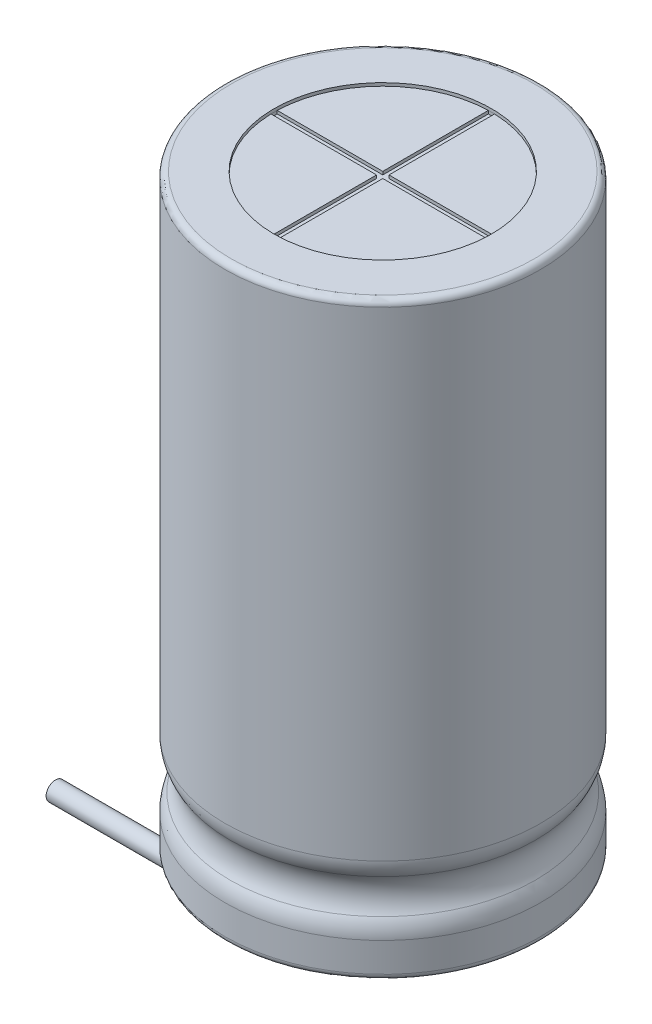
ISO-10303-21;
HEADER;
FILE_DESCRIPTION(('STEP AP214'),'2;1');
FILE_NAME('part.step','',(''),(''),'','','');
FILE_SCHEMA(('AUTOMOTIVE_DESIGN { 1 0 10303 214 1 1 1 1 }'));
ENDSEC;
DATA;
#1=APPLICATION_CONTEXT('core data for automotive mechanical design processes');
#2=APPLICATION_PROTOCOL_DEFINITION('international standard','automotive_design',2000,#1);
#3=PRODUCT_CONTEXT('',#1,'mechanical');
#4=PRODUCT('Part','Part','',(#3));
#5=PRODUCT_RELATED_PRODUCT_CATEGORY('part','',(#4));
#6=PRODUCT_DEFINITION_FORMATION('','',#4);
#7=PRODUCT_DEFINITION_CONTEXT('part definition',#1,'design');
#8=PRODUCT_DEFINITION('design','',#6,#7);
#9=PRODUCT_DEFINITION_SHAPE('','',#8);
#10=(LENGTH_UNIT() NAMED_UNIT(*) SI_UNIT(.MILLI.,.METRE.));
#11=(NAMED_UNIT(*) PLANE_ANGLE_UNIT() SI_UNIT($,.RADIAN.));
#12=(NAMED_UNIT(*) SI_UNIT($,.STERADIAN.) SOLID_ANGLE_UNIT());
#13=UNCERTAINTY_MEASURE_WITH_UNIT(LENGTH_MEASURE(1.E-05),#10,'distance_accuracy_value','');
#14=(GEOMETRIC_REPRESENTATION_CONTEXT(3) GLOBAL_UNCERTAINTY_ASSIGNED_CONTEXT((#13)) GLOBAL_UNIT_ASSIGNED_CONTEXT((#10,
#11,#12)) REPRESENTATION_CONTEXT('',''));
#15=CARTESIAN_POINT('',(0.,0.,0.));
#16=DIRECTION('',(0.,0.,1.));
#17=DIRECTION('',(1.,0.,0.));
#18=AXIS2_PLACEMENT_3D('',#15,#16,#17);
#19=CARTESIAN_POINT('',(0.,18.9,0.));
#20=DIRECTION('',(0.,1.,0.));
#21=DIRECTION('',(0.,0.,1.));
#22=AXIS2_PLACEMENT_3D('',#19,#20,#21);
#23=PLANE('',#22);
#24=DIRECTION('',(-1.,0.,0.));
#25=VECTOR('',#24,1.);
#26=CARTESIAN_POINT('',(0.,18.9,-0.1));
#27=LINE('',#26,#25);
#28=CARTESIAN_POINT('',(3.49857113690718,18.9,-0.100000000000012));
#29=VERTEX_POINT('',#28);
#30=CARTESIAN_POINT('',(0.1,18.9,-0.100000000000001));
#31=VERTEX_POINT('',#30);
#32=EDGE_CURVE('E267',#29,#31,#27,.T.);
#33=ORIENTED_EDGE('',*,*,#32,.F.);
#34=CARTESIAN_POINT('',(0.,18.9,0.));
#35=DIRECTION('',(0.,1.,0.));
#36=DIRECTION('',(0.,0.,1.));
#37=AXIS2_PLACEMENT_3D('',#34,#35,#36);
#38=CIRCLE('',#37,3.5);
#39=CARTESIAN_POINT('',(0.1,18.9,-3.49857113690718));
#40=VERTEX_POINT('',#39);
#41=EDGE_CURVE('E333',#29,#40,#38,.T.);
#42=ORIENTED_EDGE('',*,*,#41,.T.);
#43=DIRECTION('',(0.,0.,-1.));
#44=VECTOR('',#43,1.);
#45=CARTESIAN_POINT('',(0.1,18.9,0.));
#46=LINE('',#45,#44);
#47=EDGE_CURVE('E309',#31,#40,#46,.T.);
#48=ORIENTED_EDGE('',*,*,#47,.F.);
#49=EDGE_LOOP('',(#33,#42,#48));
#50=FACE_BOUND('',#49,.T.);
#51=ADVANCED_FACE('F41',(#50),#23,.T.);
#52=CARTESIAN_POINT('',(-0.1,18.9,-0.0999999999999998));
#53=VERTEX_POINT('',#52);
#54=CARTESIAN_POINT('',(-3.49857113690718,18.9,-0.099999999999988));
#55=VERTEX_POINT('',#54);
#56=EDGE_CURVE('E477',#53,#55,#27,.T.);
#57=ORIENTED_EDGE('',*,*,#56,.F.);
#58=DIRECTION('',(0.,0.,1.));
#59=VECTOR('',#58,1.);
#60=CARTESIAN_POINT('',(-0.1,18.9,0.));
#61=LINE('',#60,#59);
#62=CARTESIAN_POINT('',(-0.1,18.9,-3.49857113690718));
#63=VERTEX_POINT('',#62);
#64=EDGE_CURVE('E45',#63,#53,#61,.T.);
#65=ORIENTED_EDGE('',*,*,#64,.F.);
#66=EDGE_CURVE('E454',#63,#55,#38,.T.);
#67=ORIENTED_EDGE('',*,*,#66,.T.);
#68=EDGE_LOOP('',(#57,#65,#67));
#69=FACE_BOUND('',#68,.T.);
#70=ADVANCED_FACE('F411',(#69),#23,.T.);
#71=DIRECTION('',(1.,0.,0.));
#72=VECTOR('',#71,1.);
#73=CARTESIAN_POINT('',(0.,18.9,0.0999999999999998));
#74=LINE('',#73,#72);
#75=CARTESIAN_POINT('',(-3.49857113690718,18.9,0.100000000000012));
#76=VERTEX_POINT('',#75);
#77=CARTESIAN_POINT('',(-0.1,18.9,0.100000000000012));
#78=VERTEX_POINT('',#77);
#79=EDGE_CURVE('E272',#76,#78,#74,.T.);
#80=ORIENTED_EDGE('',*,*,#79,.F.);
#81=CARTESIAN_POINT('',(-0.1,18.9,3.49857113690718));
#82=VERTEX_POINT('',#81);
#83=EDGE_CURVE('E451',#76,#82,#38,.T.);
#84=ORIENTED_EDGE('',*,*,#83,.T.);
#85=DIRECTION('',(0.,0.,1.));
#86=VECTOR('',#85,1.);
#87=CARTESIAN_POINT('',(-0.1,18.9,0.));
#88=LINE('',#87,#86);
#89=EDGE_CURVE('E226',#78,#82,#88,.T.);
#90=ORIENTED_EDGE('',*,*,#89,.F.);
#91=EDGE_LOOP('',(#80,#84,#90));
#92=FACE_BOUND('',#91,.T.);
#93=ADVANCED_FACE('F404',(#92),#23,.T.);
#94=CARTESIAN_POINT('',(0.,0.,0.));
#95=DIRECTION('',(0.,1.,0.));
#96=DIRECTION('',(0.,0.,1.));
#97=AXIS2_PLACEMENT_3D('',#94,#95,#96);
#98=PLANE('',#97);
#99=CARTESIAN_POINT('',(0.,0.,0.));
#100=DIRECTION('',(0.,-1.,0.));
#101=DIRECTION('',(0.,0.,-1.));
#102=AXIS2_PLACEMENT_3D('',#99,#100,#101);
#103=CIRCLE('',#102,3.5);
#104=CARTESIAN_POINT('',(0.,0.,-3.5));
#105=VERTEX_POINT('',#104);
#106=EDGE_CURVE('E390',#105,#105,#103,.T.);
#107=ORIENTED_EDGE('',*,*,#106,.F.);
#108=EDGE_LOOP('',(#107));
#109=FACE_BOUND('',#108,.T.);
#110=CARTESIAN_POINT('',(0.,0.,0.));
#111=DIRECTION('',(0.,1.,0.));
#112=DIRECTION('',(0.,0.,1.));
#113=AXIS2_PLACEMENT_3D('',#110,#111,#112);
#114=CIRCLE('',#113,4.88);
#115=CARTESIAN_POINT('',(0.,0.,4.88));
#116=VERTEX_POINT('',#115);
#117=EDGE_CURVE('E362',#116,#116,#114,.T.);
#118=ORIENTED_EDGE('',*,*,#117,.F.);
#119=EDGE_LOOP('',(#118));
#120=FACE_BOUND('',#119,.T.);
#121=ADVANCED_FACE('F43',(#109,#120),#98,.F.);
#122=CARTESIAN_POINT('',(0.,0.2,0.));
#123=DIRECTION('',(0.,1.,0.));
#124=DIRECTION('',(0.,0.,1.));
#125=AXIS2_PLACEMENT_3D('',#122,#123,#124);
#126=TOROIDAL_SURFACE('',#125,4.88,0.2);
#127=CARTESIAN_POINT('',(0.,0.200000000000002,0.));
#128=DIRECTION('',(0.,1.,0.));
#129=DIRECTION('',(0.,0.,1.));
#130=AXIS2_PLACEMENT_3D('',#127,#128,#129);
#131=CIRCLE('',#130,5.08);
#132=CARTESIAN_POINT('',(0.,0.200000000000002,5.08));
#133=VERTEX_POINT('',#132);
#134=EDGE_CURVE('E359',#133,#133,#131,.T.);
#135=ORIENTED_EDGE('',*,*,#134,.F.);
#136=EDGE_LOOP('',(#135));
#137=FACE_BOUND('',#136,.T.);
#138=ORIENTED_EDGE('',*,*,#117,.T.);
#139=EDGE_LOOP('',(#138));
#140=FACE_BOUND('',#139,.T.);
#141=ADVANCED_FACE('F403',(#137,#140),#126,.T.);
#142=CARTESIAN_POINT('',(0.,19.,0.));
#143=DIRECTION('',(0.,1.,0.));
#144=DIRECTION('',(0.,0.,1.));
#145=AXIS2_PLACEMENT_3D('',#142,#143,#144);
#146=CYLINDRICAL_SURFACE('',#145,5.08);
#147=CARTESIAN_POINT('',(0.,1.14367937359519,0.));
#148=DIRECTION('',(0.,1.,0.));
#149=DIRECTION('',(0.,0.,1.));
#150=AXIS2_PLACEMENT_3D('',#147,#148,#149);
#151=CIRCLE('',#150,5.08);
#152=CARTESIAN_POINT('',(0.,1.14367937359519,5.08));
#153=VERTEX_POINT('',#152);
#154=EDGE_CURVE('E355',#153,#153,#151,.T.);
#155=ORIENTED_EDGE('',*,*,#154,.F.);
#156=EDGE_LOOP('',(#155));
#157=FACE_BOUND('',#156,.T.);
#158=ORIENTED_EDGE('',*,*,#134,.T.);
#159=EDGE_LOOP('',(#158));
#160=FACE_BOUND('',#159,.T.);
#161=ADVANCED_FACE('F409',(#157,#160),#146,.T.);
#162=CARTESIAN_POINT('',(0.,1.14367937359519,0.));
#163=DIRECTION('',(0.,1.,0.));
#164=DIRECTION('',(0.,0.,1.));
#165=AXIS2_PLACEMENT_3D('',#162,#163,#164);
#166=TOROIDAL_SURFACE('',#165,4.07781010847162,1.00218989152838);
#167=CARTESIAN_POINT('',(0.,1.69270827774518,0.));
#168=DIRECTION('',(0.,1.,0.));
#169=DIRECTION('',(0.,0.,1.));
#170=AXIS2_PLACEMENT_3D('',#167,#168,#169);
#171=CIRCLE('',#170,4.91623234165102);
#172=CARTESIAN_POINT('',(0.,1.69270827774518,4.91623234165102));
#173=VERTEX_POINT('',#172);
#174=EDGE_CURVE('E351',#173,#173,#171,.T.);
#175=ORIENTED_EDGE('',*,*,#174,.F.);
#176=EDGE_LOOP('',(#175));
#177=FACE_BOUND('',#176,.T.);
#178=ORIENTED_EDGE('',*,*,#154,.T.);
#179=EDGE_LOOP('',(#178));
#180=FACE_BOUND('',#179,.T.);
#181=ADVANCED_FACE('F908',(#177,#180),#166,.T.);
#182=CARTESIAN_POINT('',(0.,2.25,0.));
#183=DIRECTION('',(0.,1.,0.));
#184=DIRECTION('',(0.,0.,1.));
#185=AXIS2_PLACEMENT_3D('',#182,#183,#184);
#186=TOROIDAL_SURFACE('',#185,5.76727272727273,1.01727272727273);
#187=CARTESIAN_POINT('',(0.,2.80729172225482,0.));
#188=DIRECTION('',(0.,1.,0.));
#189=DIRECTION('',(0.,0.,1.));
#190=AXIS2_PLACEMENT_3D('',#187,#188,#189);
#191=CIRCLE('',#190,4.91623234165102);
#192=CARTESIAN_POINT('',(0.,2.80729172225482,4.91623234165102));
#193=VERTEX_POINT('',#192);
#194=EDGE_CURVE('E347',#193,#193,#191,.T.);
#195=ORIENTED_EDGE('',*,*,#194,.F.);
#196=EDGE_LOOP('',(#195));
#197=FACE_BOUND('',#196,.T.);
#198=ORIENTED_EDGE('',*,*,#174,.T.);
#199=EDGE_LOOP('',(#198));
#200=FACE_BOUND('',#199,.T.);
#201=ADVANCED_FACE('F898',(#197,#200),#186,.F.);
#202=CARTESIAN_POINT('',(0.,3.35632062640481,0.));
#203=DIRECTION('',(0.,1.,0.));
#204=DIRECTION('',(0.,0.,1.));
#205=AXIS2_PLACEMENT_3D('',#202,#203,#204);
#206=TOROIDAL_SURFACE('',#205,4.07781010847162,1.00218989152838);
#207=CARTESIAN_POINT('',(0.,3.35632062640481,0.));
#208=DIRECTION('',(0.,1.,0.));
#209=DIRECTION('',(0.,0.,1.));
#210=AXIS2_PLACEMENT_3D('',#207,#208,#209);
#211=CIRCLE('',#210,5.08);
#212=CARTESIAN_POINT('',(0.,3.35632062640481,5.08));
#213=VERTEX_POINT('',#212);
#214=EDGE_CURVE('E343',#213,#213,#211,.T.);
#215=ORIENTED_EDGE('',*,*,#214,.F.);
#216=EDGE_LOOP('',(#215));
#217=FACE_BOUND('',#216,.T.);
#218=ORIENTED_EDGE('',*,*,#194,.T.);
#219=EDGE_LOOP('',(#218));
#220=FACE_BOUND('',#219,.T.);
#221=ADVANCED_FACE('F888',(#217,#220),#206,.T.);
#222=CARTESIAN_POINT('',(0.,19.,0.));
#223=DIRECTION('',(0.,1.,0.));
#224=DIRECTION('',(0.,0.,1.));
#225=AXIS2_PLACEMENT_3D('',#222,#223,#224);
#226=CYLINDRICAL_SURFACE('',#225,5.08);
#227=CARTESIAN_POINT('',(0.,18.8,0.));
#228=DIRECTION('',(0.,1.,0.));
#229=DIRECTION('',(0.,0.,1.));
#230=AXIS2_PLACEMENT_3D('',#227,#228,#229);
#231=CIRCLE('',#230,5.08);
#232=CARTESIAN_POINT('',(0.,18.8,5.08));
#233=VERTEX_POINT('',#232);
#234=EDGE_CURVE('E340',#233,#233,#231,.T.);
#235=ORIENTED_EDGE('',*,*,#234,.F.);
#236=EDGE_LOOP('',(#235));
#237=FACE_BOUND('',#236,.T.);
#238=ORIENTED_EDGE('',*,*,#214,.T.);
#239=EDGE_LOOP('',(#238));
#240=FACE_BOUND('',#239,.T.);
#241=ADVANCED_FACE('F878',(#237,#240),#226,.T.);
#242=CARTESIAN_POINT('',(0.,18.8,0.));
#243=DIRECTION('',(0.,1.,0.));
#244=DIRECTION('',(0.,0.,1.));
#245=AXIS2_PLACEMENT_3D('',#242,#243,#244);
#246=TOROIDAL_SURFACE('',#245,4.88,0.199999999999999);
#247=CARTESIAN_POINT('',(0.,19.,0.));
#248=DIRECTION('',(0.,1.,0.));
#249=DIRECTION('',(0.,0.,1.));
#250=AXIS2_PLACEMENT_3D('',#247,#248,#249);
#251=CIRCLE('',#250,4.88);
#252=CARTESIAN_POINT('',(0.,19.,4.88));
#253=VERTEX_POINT('',#252);
#254=EDGE_CURVE('E332',#253,#253,#251,.T.);
#255=ORIENTED_EDGE('',*,*,#254,.F.);
#256=EDGE_LOOP('',(#255));
#257=FACE_BOUND('',#256,.T.);
#258=ORIENTED_EDGE('',*,*,#234,.T.);
#259=EDGE_LOOP('',(#258));
#260=FACE_BOUND('',#259,.T.);
#261=ADVANCED_FACE('F868',(#257,#260),#246,.T.);
#262=CARTESIAN_POINT('',(0.,19.,-4.88));
#263=DIRECTION('',(0.,-1.,0.));
#264=DIRECTION('',(0.,0.,-1.));
#265=AXIS2_PLACEMENT_3D('',#262,#263,#264);
#266=PLANE('',#265);
#267=CARTESIAN_POINT('',(0.,19.,0.));
#268=DIRECTION('',(0.,1.,0.));
#269=DIRECTION('',(0.,0.,1.));
#270=AXIS2_PLACEMENT_3D('',#267,#268,#269);
#271=CIRCLE('',#270,3.5);
#272=CARTESIAN_POINT('',(0.,19.,3.5));
#273=VERTEX_POINT('',#272);
#274=EDGE_CURVE('E325',#273,#273,#271,.T.);
#275=ORIENTED_EDGE('',*,*,#274,.F.);
#276=EDGE_LOOP('',(#275));
#277=FACE_BOUND('',#276,.T.);
#278=ORIENTED_EDGE('',*,*,#254,.T.);
#279=EDGE_LOOP('',(#278));
#280=FACE_BOUND('',#279,.T.);
#281=ADVANCED_FACE('F434',(#277,#280),#266,.F.);
#282=CARTESIAN_POINT('',(0.,18.9,0.));
#283=DIRECTION('',(0.,1.,0.));
#284=DIRECTION('',(0.,0.,1.));
#285=AXIS2_PLACEMENT_3D('',#282,#283,#284);
#286=CYLINDRICAL_SURFACE('',#285,3.5);
#287=CARTESIAN_POINT('',(0.,18.9,-3.5));
#288=VERTEX_POINT('',#287);
#289=EDGE_CURVE('E329',#40,#288,#38,.T.);
#290=ORIENTED_EDGE('',*,*,#289,.F.);
#291=ORIENTED_EDGE('',*,*,#41,.F.);
#292=CARTESIAN_POINT('',(0.,18.9,0.));
#293=DIRECTION('',(0.,-1.,0.));
#294=DIRECTION('',(0.,0.,-1.));
#295=AXIS2_PLACEMENT_3D('',#292,#293,#294);
#296=CIRCLE('',#295,3.5);
#297=CARTESIAN_POINT('',(3.5,18.9,0.));
#298=VERTEX_POINT('',#297);
#299=EDGE_CURVE('E292',#298,#29,#296,.F.);
#300=ORIENTED_EDGE('',*,*,#299,.F.);
#301=CARTESIAN_POINT('',(3.49857113690718,18.9,0.0999999999999632));
#302=VERTEX_POINT('',#301);
#303=EDGE_CURVE('E295',#302,#298,#296,.F.);
#304=ORIENTED_EDGE('',*,*,#303,.F.);
#305=CARTESIAN_POINT('',(0.1,18.9,3.49857113690718));
#306=VERTEX_POINT('',#305);
#307=EDGE_CURVE('E440',#306,#302,#38,.T.);
#308=ORIENTED_EDGE('',*,*,#307,.F.);
#309=CARTESIAN_POINT('',(0.,18.9,3.5));
#310=VERTEX_POINT('',#309);
#311=EDGE_CURVE('E448',#310,#306,#296,.F.);
#312=ORIENTED_EDGE('',*,*,#311,.F.);
#313=EDGE_CURVE('E500',#82,#310,#296,.F.);
#314=ORIENTED_EDGE('',*,*,#313,.F.);
#315=ORIENTED_EDGE('',*,*,#83,.F.);
#316=CARTESIAN_POINT('',(-3.5,18.9,0.));
#317=VERTEX_POINT('',#316);
#318=EDGE_CURVE('E493',#317,#76,#296,.F.);
#319=ORIENTED_EDGE('',*,*,#318,.F.);
#320=EDGE_CURVE('E296',#55,#317,#296,.F.);
#321=ORIENTED_EDGE('',*,*,#320,.F.);
#322=ORIENTED_EDGE('',*,*,#66,.F.);
#323=EDGE_CURVE('E67',#288,#63,#38,.T.);
#324=ORIENTED_EDGE('',*,*,#323,.F.);
#325=EDGE_LOOP('',(#290,#291,#300,#304,#308,#312,#314,#315,#319,#321,#322,#324));
#326=FACE_BOUND('',#325,.T.);
#327=ORIENTED_EDGE('',*,*,#274,.T.);
#328=EDGE_LOOP('',(#327));
#329=FACE_BOUND('',#328,.T.);
#330=ADVANCED_FACE('F426',(#326,#329),#286,.F.);
#331=DIRECTION('',(0.,0.,-1.));
#332=VECTOR('',#331,1.);
#333=CARTESIAN_POINT('',(0.1,18.9,0.));
#334=LINE('',#333,#332);
#335=CARTESIAN_POINT('',(0.1,18.9,0.0999999999999988));
#336=VERTEX_POINT('',#335);
#337=EDGE_CURVE('E235',#306,#336,#334,.T.);
#338=ORIENTED_EDGE('',*,*,#337,.F.);
#339=ORIENTED_EDGE('',*,*,#307,.T.);
#340=DIRECTION('',(1.,0.,0.));
#341=VECTOR('',#340,1.);
#342=CARTESIAN_POINT('',(0.,18.9,0.0999999999999998));
#343=LINE('',#342,#341);
#344=EDGE_CURVE('E204',#336,#302,#343,.T.);
#345=ORIENTED_EDGE('',*,*,#344,.F.);
#346=EDGE_LOOP('',(#338,#339,#345));
#347=FACE_BOUND('',#346,.T.);
#348=ADVANCED_FACE('F414',(#347),#23,.T.);
#349=CARTESIAN_POINT('',(0.,18.9,0.));
#350=DIRECTION('',(0.,-1.,0.));
#351=DIRECTION('',(0.,0.,-1.));
#352=AXIS2_PLACEMENT_3D('',#349,#350,#351);
#353=PLANE('',#352);
#354=ORIENTED_EDGE('',*,*,#323,.T.);
#355=DIRECTION('',(0.,0.,1.));
#356=VECTOR('',#355,1.);
#357=CARTESIAN_POINT('',(-0.1,18.9,0.));
#358=LINE('',#357,#356);
#359=CARTESIAN_POINT('',(-0.1,18.9,-3.5));
#360=VERTEX_POINT('',#359);
#361=EDGE_CURVE('E301',#360,#63,#358,.T.);
#362=ORIENTED_EDGE('',*,*,#361,.F.);
#363=DIRECTION('',(-1.,0.,0.));
#364=VECTOR('',#363,1.);
#365=CARTESIAN_POINT('',(0.1,18.9,-3.5));
#366=LINE('',#365,#364);
#367=EDGE_CURVE('E313',#288,#360,#366,.T.);
#368=ORIENTED_EDGE('',*,*,#367,.F.);
#369=EDGE_LOOP('',(#354,#362,#368));
#370=FACE_BOUND('',#369,.T.);
#371=ADVANCED_FACE('F425',(#370),#353,.T.);
#372=ORIENTED_EDGE('',*,*,#289,.T.);
#373=CARTESIAN_POINT('',(0.1,18.9,-3.5));
#374=VERTEX_POINT('',#373);
#375=EDGE_CURVE('E315',#374,#288,#366,.T.);
#376=ORIENTED_EDGE('',*,*,#375,.F.);
#377=EDGE_CURVE('E314',#40,#374,#46,.T.);
#378=ORIENTED_EDGE('',*,*,#377,.F.);
#379=EDGE_LOOP('',(#372,#376,#378));
#380=FACE_BOUND('',#379,.T.);
#381=ADVANCED_FACE('F432',(#380),#353,.T.);
#382=CARTESIAN_POINT('',(-0.1,18.8,0.));
#383=DIRECTION('',(-1.,0.,0.));
#384=DIRECTION('',(0.,0.,1.));
#385=AXIS2_PLACEMENT_3D('',#382,#383,#384);
#386=PLANE('',#385);
#387=ORIENTED_EDGE('',*,*,#64,.T.);
#388=DIRECTION('',(0.,-1.,0.));
#389=VECTOR('',#388,1.);
#390=CARTESIAN_POINT('',(-0.1,18.8,-0.0999999999999998));
#391=LINE('',#390,#389);
#392=CARTESIAN_POINT('',(-0.1,18.8,-0.0999999999999998));
#393=VERTEX_POINT('',#392);
#394=EDGE_CURVE('E288',#53,#393,#391,.T.);
#395=ORIENTED_EDGE('',*,*,#394,.T.);
#396=DIRECTION('',(0.,0.,1.));
#397=VECTOR('',#396,1.);
#398=CARTESIAN_POINT('',(-0.1,18.8,0.));
#399=LINE('',#398,#397);
#400=CARTESIAN_POINT('',(-0.1,18.8,-3.5));
#401=VERTEX_POINT('',#400);
#402=EDGE_CURVE('E305',#401,#393,#399,.T.);
#403=ORIENTED_EDGE('',*,*,#402,.F.);
#404=DIRECTION('',(0.,1.,0.));
#405=VECTOR('',#404,1.);
#406=CARTESIAN_POINT('',(-0.1,18.8,-3.5));
#407=LINE('',#406,#405);
#408=EDGE_CURVE('E321',#401,#360,#407,.T.);
#409=ORIENTED_EDGE('',*,*,#408,.T.);
#410=ORIENTED_EDGE('',*,*,#361,.T.);
#411=EDGE_LOOP('',(#387,#395,#403,#409,#410));
#412=FACE_BOUND('',#411,.T.);
#413=ADVANCED_FACE('F519',(#412),#386,.F.);
#414=CARTESIAN_POINT('',(0.1,18.8,-3.5));
#415=DIRECTION('',(0.,0.,-1.));
#416=DIRECTION('',(-1.,0.,0.));
#417=AXIS2_PLACEMENT_3D('',#414,#415,#416);
#418=PLANE('',#417);
#419=ORIENTED_EDGE('',*,*,#375,.T.);
#420=ORIENTED_EDGE('',*,*,#367,.T.);
#421=ORIENTED_EDGE('',*,*,#408,.F.);
#422=DIRECTION('',(-1.,0.,0.));
#423=VECTOR('',#422,1.);
#424=CARTESIAN_POINT('',(0.1,18.8,-3.5));
#425=LINE('',#424,#423);
#426=CARTESIAN_POINT('',(0.1,18.8,-3.5));
#427=VERTEX_POINT('',#426);
#428=EDGE_CURVE('E300',#427,#401,#425,.T.);
#429=ORIENTED_EDGE('',*,*,#428,.F.);
#430=DIRECTION('',(0.,1.,0.));
#431=VECTOR('',#430,1.);
#432=CARTESIAN_POINT('',(0.1,18.8,-3.5));
#433=LINE('',#432,#431);
#434=EDGE_CURVE('E308',#427,#374,#433,.T.);
#435=ORIENTED_EDGE('',*,*,#434,.T.);
#436=EDGE_LOOP('',(#419,#420,#421,#429,#435));
#437=FACE_BOUND('',#436,.T.);
#438=ADVANCED_FACE('F554',(#437),#418,.F.);
#439=CARTESIAN_POINT('',(0.1,18.8,0.));
#440=DIRECTION('',(1.,0.,0.));
#441=DIRECTION('',(0.,0.,-1.));
#442=AXIS2_PLACEMENT_3D('',#439,#440,#441);
#443=PLANE('',#442);
#444=DIRECTION('',(0.,0.,-1.));
#445=VECTOR('',#444,1.);
#446=CARTESIAN_POINT('',(0.1,18.8,0.));
#447=LINE('',#446,#445);
#448=CARTESIAN_POINT('',(0.1,18.8,-0.1));
#449=VERTEX_POINT('',#448);
#450=EDGE_CURVE('E297',#449,#427,#447,.T.);
#451=ORIENTED_EDGE('',*,*,#450,.F.);
#452=DIRECTION('',(0.,1.,0.));
#453=VECTOR('',#452,1.);
#454=CARTESIAN_POINT('',(0.1,18.8,-0.100000000000001));
#455=LINE('',#454,#453);
#456=EDGE_CURVE('E281',#449,#31,#455,.T.);
#457=ORIENTED_EDGE('',*,*,#456,.T.);
#458=ORIENTED_EDGE('',*,*,#47,.T.);
#459=ORIENTED_EDGE('',*,*,#377,.T.);
#460=ORIENTED_EDGE('',*,*,#434,.F.);
#461=EDGE_LOOP('',(#451,#457,#458,#459,#460));
#462=FACE_BOUND('',#461,.T.);
#463=ADVANCED_FACE('F462',(#462),#443,.F.);
#464=CARTESIAN_POINT('',(0.,18.8,0.));
#465=DIRECTION('',(0.,-1.,0.));
#466=DIRECTION('',(0.,0.,-1.));
#467=AXIS2_PLACEMENT_3D('',#464,#465,#466);
#468=PLANE('',#467);
#469=ORIENTED_EDGE('',*,*,#402,.T.);
#470=DIRECTION('',(-1.,0.,0.));
#471=VECTOR('',#470,1.);
#472=CARTESIAN_POINT('',(0.,18.8,-0.1));
#473=LINE('',#472,#471);
#474=CARTESIAN_POINT('',(-3.5,18.8,-0.0999999999999879));
#475=VERTEX_POINT('',#474);
#476=EDGE_CURVE('E253',#393,#475,#473,.T.);
#477=ORIENTED_EDGE('',*,*,#476,.T.);
#478=DIRECTION('',(0.,0.,1.));
#479=VECTOR('',#478,1.);
#480=CARTESIAN_POINT('',(-3.5,18.8,-0.0999999999999879));
#481=LINE('',#480,#479);
#482=CARTESIAN_POINT('',(-3.5,18.8,0.100000000000012));
#483=VERTEX_POINT('',#482);
#484=EDGE_CURVE('E252',#475,#483,#481,.T.);
#485=ORIENTED_EDGE('',*,*,#484,.T.);
#486=DIRECTION('',(1.,0.,0.));
#487=VECTOR('',#486,1.);
#488=CARTESIAN_POINT('',(0.,18.8,0.0999999999999998));
#489=LINE('',#488,#487);
#490=CARTESIAN_POINT('',(-0.1,18.8,0.100000000000012));
#491=VERTEX_POINT('',#490);
#492=EDGE_CURVE('E257',#483,#491,#489,.T.);
#493=ORIENTED_EDGE('',*,*,#492,.T.);
#494=DIRECTION('',(0.,0.,1.));
#495=VECTOR('',#494,1.);
#496=CARTESIAN_POINT('',(-0.1,18.8,0.));
#497=LINE('',#496,#495);
#498=CARTESIAN_POINT('',(-0.1,18.8,3.5));
#499=VERTEX_POINT('',#498);
#500=EDGE_CURVE('E216',#491,#499,#497,.T.);
#501=ORIENTED_EDGE('',*,*,#500,.T.);
#502=DIRECTION('',(1.,0.,0.));
#503=VECTOR('',#502,1.);
#504=CARTESIAN_POINT('',(-0.1,18.8,3.5));
#505=LINE('',#504,#503);
#506=CARTESIAN_POINT('',(0.1,18.8,3.5));
#507=VERTEX_POINT('',#506);
#508=EDGE_CURVE('E219',#499,#507,#505,.T.);
#509=ORIENTED_EDGE('',*,*,#508,.T.);
#510=DIRECTION('',(0.,0.,-1.));
#511=VECTOR('',#510,1.);
#512=CARTESIAN_POINT('',(0.1,18.8,0.));
#513=LINE('',#512,#511);
#514=CARTESIAN_POINT('',(0.1,18.8,0.0999999999999988));
#515=VERTEX_POINT('',#514);
#516=EDGE_CURVE('E178',#507,#515,#513,.T.);
#517=ORIENTED_EDGE('',*,*,#516,.T.);
#518=DIRECTION('',(1.,0.,0.));
#519=VECTOR('',#518,1.);
#520=CARTESIAN_POINT('',(0.,18.8,0.0999999999999998));
#521=LINE('',#520,#519);
#522=CARTESIAN_POINT('',(3.5,18.8,0.0999999999999632));
#523=VERTEX_POINT('',#522);
#524=EDGE_CURVE('E170',#515,#523,#521,.T.);
#525=ORIENTED_EDGE('',*,*,#524,.T.);
#526=DIRECTION('',(0.,0.,-1.));
#527=VECTOR('',#526,1.);
#528=CARTESIAN_POINT('',(3.5,18.8,0.0999999999999632));
#529=LINE('',#528,#527);
#530=CARTESIAN_POINT('',(3.5,18.8,-0.100000000000037));
#531=VERTEX_POINT('',#530);
#532=EDGE_CURVE('E175',#523,#531,#529,.T.);
#533=ORIENTED_EDGE('',*,*,#532,.T.);
#534=EDGE_CURVE('E59',#531,#449,#473,.T.);
#535=ORIENTED_EDGE('',*,*,#534,.T.);
#536=ORIENTED_EDGE('',*,*,#450,.T.);
#537=ORIENTED_EDGE('',*,*,#428,.T.);
#538=EDGE_LOOP('',(#469,#477,#485,#493,#501,#509,#517,#525,#533,#535,#536,#537));
#539=FACE_BOUND('',#538,.T.);
#540=ADVANCED_FACE('F173',(#539),#468,.F.);
#541=CARTESIAN_POINT('',(0.,18.9,0.));
#542=DIRECTION('',(0.,-1.,0.));
#543=DIRECTION('',(-1.,0.,0.));
#544=AXIS2_PLACEMENT_3D('',#541,#542,#543);
#545=PLANE('',#544);
#546=ORIENTED_EDGE('',*,*,#320,.T.);
#547=DIRECTION('',(0.,0.,1.));
#548=VECTOR('',#547,1.);
#549=CARTESIAN_POINT('',(-3.5,18.9,-0.0999999999999879));
#550=LINE('',#549,#548);
#551=CARTESIAN_POINT('',(-3.5,18.9,-0.0999999999999879));
#552=VERTEX_POINT('',#551);
#553=EDGE_CURVE('E268',#552,#317,#550,.T.);
#554=ORIENTED_EDGE('',*,*,#553,.F.);
#555=EDGE_CURVE('E249',#55,#552,#27,.T.);
#556=ORIENTED_EDGE('',*,*,#555,.F.);
#557=EDGE_LOOP('',(#546,#554,#556));
#558=FACE_BOUND('',#557,.T.);
#559=ADVANCED_FACE('F491',(#558),#545,.T.);
#560=ORIENTED_EDGE('',*,*,#318,.T.);
#561=CARTESIAN_POINT('',(-3.5,18.9,0.100000000000012));
#562=VERTEX_POINT('',#561);
#563=EDGE_CURVE('E273',#562,#76,#74,.T.);
#564=ORIENTED_EDGE('',*,*,#563,.F.);
#565=EDGE_CURVE('E266',#317,#562,#550,.T.);
#566=ORIENTED_EDGE('',*,*,#565,.F.);
#567=EDGE_LOOP('',(#560,#564,#566));
#568=FACE_BOUND('',#567,.T.);
#569=ADVANCED_FACE('F496',(#568),#545,.T.);
#570=ORIENTED_EDGE('',*,*,#313,.T.);
#571=DIRECTION('',(1.,0.,0.));
#572=VECTOR('',#571,1.);
#573=CARTESIAN_POINT('',(-0.1,18.9,3.5));
#574=LINE('',#573,#572);
#575=CARTESIAN_POINT('',(-0.1,18.9,3.5));
#576=VERTEX_POINT('',#575);
#577=EDGE_CURVE('E231',#576,#310,#574,.T.);
#578=ORIENTED_EDGE('',*,*,#577,.F.);
#579=EDGE_CURVE('E215',#82,#576,#88,.T.);
#580=ORIENTED_EDGE('',*,*,#579,.F.);
#581=EDGE_LOOP('',(#570,#578,#580));
#582=FACE_BOUND('',#581,.T.);
#583=ADVANCED_FACE('F529',(#582),#545,.T.);
#584=ORIENTED_EDGE('',*,*,#311,.T.);
#585=CARTESIAN_POINT('',(0.1,18.9,3.5));
#586=VERTEX_POINT('',#585);
#587=EDGE_CURVE('E220',#586,#306,#334,.T.);
#588=ORIENTED_EDGE('',*,*,#587,.F.);
#589=EDGE_CURVE('E230',#310,#586,#574,.T.);
#590=ORIENTED_EDGE('',*,*,#589,.F.);
#591=EDGE_LOOP('',(#584,#588,#590));
#592=FACE_BOUND('',#591,.T.);
#593=ADVANCED_FACE('F531',(#592),#545,.T.);
#594=ORIENTED_EDGE('',*,*,#303,.T.);
#595=DIRECTION('',(0.,0.,-1.));
#596=VECTOR('',#595,1.);
#597=CARTESIAN_POINT('',(3.5,18.9,0.0999999999999632));
#598=LINE('',#597,#596);
#599=CARTESIAN_POINT('',(3.5,18.9,0.0999999999999632));
#600=VERTEX_POINT('',#599);
#601=EDGE_CURVE('E182',#600,#298,#598,.T.);
#602=ORIENTED_EDGE('',*,*,#601,.F.);
#603=EDGE_CURVE('E188',#302,#600,#343,.T.);
#604=ORIENTED_EDGE('',*,*,#603,.F.);
#605=EDGE_LOOP('',(#594,#602,#604));
#606=FACE_BOUND('',#605,.T.);
#607=ADVANCED_FACE('F510',(#606),#545,.T.);
#608=ORIENTED_EDGE('',*,*,#299,.T.);
#609=CARTESIAN_POINT('',(3.5,18.9,-0.100000000000037));
#610=VERTEX_POINT('',#609);
#611=EDGE_CURVE('E262',#610,#29,#27,.T.);
#612=ORIENTED_EDGE('',*,*,#611,.F.);
#613=EDGE_CURVE('E207',#298,#610,#598,.T.);
#614=ORIENTED_EDGE('',*,*,#613,.F.);
#615=EDGE_LOOP('',(#608,#612,#614));
#616=FACE_BOUND('',#615,.T.);
#617=ADVANCED_FACE('F513',(#616),#545,.T.);
#618=CARTESIAN_POINT('',(0.,18.8,-0.1));
#619=DIRECTION('',(0.,0.,-1.));
#620=DIRECTION('',(-1.,0.,0.));
#621=AXIS2_PLACEMENT_3D('',#618,#619,#620);
#622=PLANE('',#621);
#623=ORIENTED_EDGE('',*,*,#56,.T.);
#624=ORIENTED_EDGE('',*,*,#555,.T.);
#625=DIRECTION('',(0.,1.,0.));
#626=VECTOR('',#625,1.);
#627=CARTESIAN_POINT('',(-3.5,18.8,-0.0999999999999879));
#628=LINE('',#627,#626);
#629=EDGE_CURVE('E261',#475,#552,#628,.T.);
#630=ORIENTED_EDGE('',*,*,#629,.F.);
#631=ORIENTED_EDGE('',*,*,#476,.F.);
#632=ORIENTED_EDGE('',*,*,#394,.F.);
#633=EDGE_LOOP('',(#623,#624,#630,#631,#632));
#634=FACE_BOUND('',#633,.T.);
#635=ADVANCED_FACE('F484',(#634),#622,.F.);
#636=ORIENTED_EDGE('',*,*,#534,.F.);
#637=DIRECTION('',(0.,1.,0.));
#638=VECTOR('',#637,1.);
#639=CARTESIAN_POINT('',(3.5,18.8,-0.100000000000037));
#640=LINE('',#639,#638);
#641=EDGE_CURVE('E193',#531,#610,#640,.T.);
#642=ORIENTED_EDGE('',*,*,#641,.T.);
#643=ORIENTED_EDGE('',*,*,#611,.T.);
#644=ORIENTED_EDGE('',*,*,#32,.T.);
#645=ORIENTED_EDGE('',*,*,#456,.F.);
#646=EDGE_LOOP('',(#636,#642,#643,#644,#645));
#647=FACE_BOUND('',#646,.T.);
#648=ADVANCED_FACE('F515',(#647),#622,.F.);
#649=CARTESIAN_POINT('',(0.,18.8,0.0999999999999998));
#650=DIRECTION('',(0.,0.,1.));
#651=DIRECTION('',(1.,0.,0.));
#652=AXIS2_PLACEMENT_3D('',#649,#650,#651);
#653=PLANE('',#652);
#654=DIRECTION('',(0.,-1.,0.));
#655=VECTOR('',#654,1.);
#656=CARTESIAN_POINT('',(-0.1,18.8,0.1));
#657=LINE('',#656,#655);
#658=EDGE_CURVE('E243',#78,#491,#657,.T.);
#659=ORIENTED_EDGE('',*,*,#658,.T.);
#660=ORIENTED_EDGE('',*,*,#492,.F.);
#661=DIRECTION('',(0.,1.,0.));
#662=VECTOR('',#661,1.);
#663=CARTESIAN_POINT('',(-3.5,18.8,0.100000000000012));
#664=LINE('',#663,#662);
#665=EDGE_CURVE('E277',#483,#562,#664,.T.);
#666=ORIENTED_EDGE('',*,*,#665,.T.);
#667=ORIENTED_EDGE('',*,*,#563,.T.);
#668=ORIENTED_EDGE('',*,*,#79,.T.);
#669=EDGE_LOOP('',(#659,#660,#666,#667,#668));
#670=FACE_BOUND('',#669,.T.);
#671=ADVANCED_FACE('F541',(#670),#653,.F.);
#672=CARTESIAN_POINT('',(-3.5,18.8,-0.0999999999999879));
#673=DIRECTION('',(-1.,0.,0.));
#674=DIRECTION('',(0.,0.,1.));
#675=AXIS2_PLACEMENT_3D('',#672,#673,#674);
#676=PLANE('',#675);
#677=ORIENTED_EDGE('',*,*,#553,.T.);
#678=ORIENTED_EDGE('',*,*,#565,.T.);
#679=ORIENTED_EDGE('',*,*,#665,.F.);
#680=ORIENTED_EDGE('',*,*,#484,.F.);
#681=ORIENTED_EDGE('',*,*,#629,.T.);
#682=EDGE_LOOP('',(#677,#678,#679,#680,#681));
#683=FACE_BOUND('',#682,.T.);
#684=ADVANCED_FACE('F489',(#683),#676,.F.);
#685=CARTESIAN_POINT('',(0.1,18.8,0.));
#686=DIRECTION('',(1.,0.,0.));
#687=DIRECTION('',(0.,0.,-1.));
#688=AXIS2_PLACEMENT_3D('',#685,#686,#687);
#689=PLANE('',#688);
#690=DIRECTION('',(0.,-1.,0.));
#691=VECTOR('',#690,1.);
#692=CARTESIAN_POINT('',(0.1,18.8,0.0999999999999988));
#693=LINE('',#692,#691);
#694=EDGE_CURVE('E211',#336,#515,#693,.T.);
#695=ORIENTED_EDGE('',*,*,#694,.T.);
#696=ORIENTED_EDGE('',*,*,#516,.F.);
#697=DIRECTION('',(0.,1.,0.));
#698=VECTOR('',#697,1.);
#699=CARTESIAN_POINT('',(0.1,18.8,3.5));
#700=LINE('',#699,#698);
#701=EDGE_CURVE('E239',#507,#586,#700,.T.);
#702=ORIENTED_EDGE('',*,*,#701,.T.);
#703=ORIENTED_EDGE('',*,*,#587,.T.);
#704=ORIENTED_EDGE('',*,*,#337,.T.);
#705=EDGE_LOOP('',(#695,#696,#702,#703,#704));
#706=FACE_BOUND('',#705,.T.);
#707=ADVANCED_FACE('F547',(#706),#689,.F.);
#708=CARTESIAN_POINT('',(-0.1,18.8,3.5));
#709=DIRECTION('',(0.,0.,1.));
#710=DIRECTION('',(0.,-1.,0.));
#711=AXIS2_PLACEMENT_3D('',#708,#709,#710);
#712=PLANE('',#711);
#713=ORIENTED_EDGE('',*,*,#577,.T.);
#714=ORIENTED_EDGE('',*,*,#589,.T.);
#715=ORIENTED_EDGE('',*,*,#701,.F.);
#716=ORIENTED_EDGE('',*,*,#508,.F.);
#717=DIRECTION('',(0.,1.,0.));
#718=VECTOR('',#717,1.);
#719=CARTESIAN_POINT('',(-0.1,18.8,3.5));
#720=LINE('',#719,#718);
#721=EDGE_CURVE('E225',#499,#576,#720,.T.);
#722=ORIENTED_EDGE('',*,*,#721,.T.);
#723=EDGE_LOOP('',(#713,#714,#715,#716,#722));
#724=FACE_BOUND('',#723,.T.);
#725=ADVANCED_FACE('F528',(#724),#712,.F.);
#726=CARTESIAN_POINT('',(-0.1,18.8,0.));
#727=DIRECTION('',(-1.,0.,0.));
#728=DIRECTION('',(0.,0.,1.));
#729=AXIS2_PLACEMENT_3D('',#726,#727,#728);
#730=PLANE('',#729);
#731=ORIENTED_EDGE('',*,*,#89,.T.);
#732=ORIENTED_EDGE('',*,*,#579,.T.);
#733=ORIENTED_EDGE('',*,*,#721,.F.);
#734=ORIENTED_EDGE('',*,*,#500,.F.);
#735=ORIENTED_EDGE('',*,*,#658,.F.);
#736=EDGE_LOOP('',(#731,#732,#733,#734,#735));
#737=FACE_BOUND('',#736,.T.);
#738=ADVANCED_FACE('F522',(#737),#730,.F.);
#739=CARTESIAN_POINT('',(3.5,18.8,0.0999999999999632));
#740=DIRECTION('',(1.,0.,0.));
#741=DIRECTION('',(0.,0.,-1.));
#742=AXIS2_PLACEMENT_3D('',#739,#740,#741);
#743=PLANE('',#742);
#744=ORIENTED_EDGE('',*,*,#601,.T.);
#745=ORIENTED_EDGE('',*,*,#613,.T.);
#746=ORIENTED_EDGE('',*,*,#641,.F.);
#747=ORIENTED_EDGE('',*,*,#532,.F.);
#748=DIRECTION('',(0.,1.,0.));
#749=VECTOR('',#748,1.);
#750=CARTESIAN_POINT('',(3.5,18.8,0.0999999999999632));
#751=LINE('',#750,#749);
#752=EDGE_CURVE('E185',#523,#600,#751,.T.);
#753=ORIENTED_EDGE('',*,*,#752,.T.);
#754=EDGE_LOOP('',(#744,#745,#746,#747,#753));
#755=FACE_BOUND('',#754,.T.);
#756=ADVANCED_FACE('F196',(#755),#743,.F.);
#757=CARTESIAN_POINT('',(0.,18.8,0.0999999999999998));
#758=DIRECTION('',(0.,0.,1.));
#759=DIRECTION('',(1.,0.,0.));
#760=AXIS2_PLACEMENT_3D('',#757,#758,#759);
#761=PLANE('',#760);
#762=ORIENTED_EDGE('',*,*,#344,.T.);
#763=ORIENTED_EDGE('',*,*,#603,.T.);
#764=ORIENTED_EDGE('',*,*,#752,.F.);
#765=ORIENTED_EDGE('',*,*,#524,.F.);
#766=ORIENTED_EDGE('',*,*,#694,.F.);
#767=EDGE_LOOP('',(#762,#763,#764,#765,#766));
#768=FACE_BOUND('',#767,.T.);
#769=ADVANCED_FACE('F187',(#768),#761,.F.);
#770=CARTESIAN_POINT('',(0.,0.6,0.));
#771=DIRECTION('',(0.,-1.,0.));
#772=DIRECTION('',(0.,0.,-1.));
#773=AXIS2_PLACEMENT_3D('',#770,#771,#772);
#774=CYLINDRICAL_SURFACE('',#773,3.5);
#775=CARTESIAN_POINT('',(0.,0.6,0.));
#776=DIRECTION('',(0.,-1.,0.));
#777=DIRECTION('',(0.,0.,-1.));
#778=AXIS2_PLACEMENT_3D('',#775,#776,#777);
#779=CIRCLE('',#778,3.5);
#780=CARTESIAN_POINT('',(0.,0.6,-3.5));
#781=VERTEX_POINT('',#780);
#782=EDGE_CURVE('E391',#781,#781,#779,.T.);
#783=ORIENTED_EDGE('',*,*,#782,.F.);
#784=EDGE_LOOP('',(#783));
#785=FACE_BOUND('',#784,.T.);
#786=ORIENTED_EDGE('',*,*,#106,.T.);
#787=EDGE_LOOP('',(#786));
#788=FACE_BOUND('',#787,.T.);
#789=ADVANCED_FACE('F399',(#785,#788),#774,.F.);
#790=CARTESIAN_POINT('',(0.,0.6,0.));
#791=DIRECTION('',(0.,-1.,0.));
#792=DIRECTION('',(0.,0.,-1.));
#793=AXIS2_PLACEMENT_3D('',#790,#791,#792);
#794=PLANE('',#793);
#795=CARTESIAN_POINT('',(0.,0.6,-2.54));
#796=DIRECTION('',(0.,-1.,0.));
#797=DIRECTION('',(0.,0.,-1.));
#798=AXIS2_PLACEMENT_3D('',#795,#796,#797);
#799=CIRCLE('',#798,0.3);
#800=CARTESIAN_POINT('',(0.,0.6,-2.84));
#801=VERTEX_POINT('',#800);
#802=EDGE_CURVE('E11',#801,#801,#799,.T.);
#803=ORIENTED_EDGE('',*,*,#802,.F.);
#804=EDGE_LOOP('',(#803));
#805=FACE_BOUND('',#804,.T.);
#806=CARTESIAN_POINT('',(0.,0.6,2.54));
#807=DIRECTION('',(0.,-1.,0.));
#808=DIRECTION('',(0.,0.,-1.));
#809=AXIS2_PLACEMENT_3D('',#806,#807,#808);
#810=CIRCLE('',#809,0.3);
#811=CARTESIAN_POINT('',(0.,0.6,2.24));
#812=VERTEX_POINT('',#811);
#813=EDGE_CURVE('E51',#812,#812,#810,.T.);
#814=ORIENTED_EDGE('',*,*,#813,.F.);
#815=EDGE_LOOP('',(#814));
#816=FACE_BOUND('',#815,.T.);
#817=ORIENTED_EDGE('',*,*,#782,.T.);
#818=EDGE_LOOP('',(#817));
#819=FACE_BOUND('',#818,.T.);
#820=ADVANCED_FACE('F652',(#805,#816,#819),#794,.T.);
#821=CARTESIAN_POINT('',(-1.,-1.,2.54));
#822=DIRECTION('',(-1.,0.,0.));
#823=DIRECTION('',(0.,-1.,0.));
#824=AXIS2_PLACEMENT_3D('',#821,#822,#823);
#825=CYLINDRICAL_SURFACE('',#824,0.3);
#826=CARTESIAN_POINT('',(-1.,-1.,2.54));
#827=DIRECTION('',(-1.,0.,0.));
#828=DIRECTION('',(0.,0.,-1.));
#829=AXIS2_PLACEMENT_3D('',#826,#827,#828);
#830=CIRCLE('',#829,0.3);
#831=CARTESIAN_POINT('',(-1.,-1.3,2.54));
#832=VERTEX_POINT('',#831);
#833=EDGE_CURVE('E382',#832,#832,#830,.T.);
#834=ORIENTED_EDGE('',*,*,#833,.T.);
#835=EDGE_LOOP('',(#834));
#836=FACE_BOUND('',#835,.T.);
#837=CARTESIAN_POINT('',(-8.,-1.,2.54));
#838=DIRECTION('',(-1.,0.,0.));
#839=DIRECTION('',(0.,0.,-1.));
#840=AXIS2_PLACEMENT_3D('',#837,#838,#839);
#841=CIRCLE('',#840,0.3);
#842=CARTESIAN_POINT('',(-8.,-1.,2.24));
#843=VERTEX_POINT('',#842);
#844=EDGE_CURVE('E386',#843,#843,#841,.T.);
#845=ORIENTED_EDGE('',*,*,#844,.F.);
#846=EDGE_LOOP('',(#845));
#847=FACE_BOUND('',#846,.T.);
#848=ADVANCED_FACE('F662',(#836,#847),#825,.T.);
#849=CARTESIAN_POINT('',(-1.,0.,2.54));
#850=DIRECTION('',(0.,0.,-1.));
#851=DIRECTION('',(-1.,0.,0.));
#852=AXIS2_PLACEMENT_3D('',#849,#850,#851);
#853=TOROIDAL_SURFACE('',#852,1.,0.3);
#854=CARTESIAN_POINT('',(0.,0.,2.54));
#855=DIRECTION('',(0.,-1.,0.));
#856=DIRECTION('',(0.,0.,-1.));
#857=AXIS2_PLACEMENT_3D('',#854,#855,#856);
#858=CIRCLE('',#857,0.3);
#859=CARTESIAN_POINT('',(0.3,0.,2.54));
#860=VERTEX_POINT('',#859);
#861=EDGE_CURVE('E380',#860,#860,#858,.T.);
#862=CARTESIAN_POINT('',(-1.,0.,2.54));
#863=DIRECTION('',(0.,0.,-1.));
#864=DIRECTION('',(-1.,0.,0.));
#865=AXIS2_PLACEMENT_3D('',#862,#863,#864);
#866=CIRCLE('',#865,1.3);
#867=EDGE_CURVE('',#860,#832,#866,.T.);
#868=ORIENTED_EDGE('',*,*,#861,.T.);
#869=ORIENTED_EDGE('',*,*,#833,.F.);
#870=ORIENTED_EDGE('',*,*,#867,.T.);
#871=ORIENTED_EDGE('',*,*,#867,.F.);
#872=EDGE_LOOP('',(#868,#870,#869,#871));
#873=FACE_BOUND('',#872,.T.);
#874=ADVANCED_FACE('F671',(#873),#853,.T.);
#875=CARTESIAN_POINT('',(0.,0.,2.54));
#876=DIRECTION('',(0.,1.,0.));
#877=DIRECTION('',(0.,0.,1.));
#878=AXIS2_PLACEMENT_3D('',#875,#876,#877);
#879=CYLINDRICAL_SURFACE('',#878,0.3);
#880=ORIENTED_EDGE('',*,*,#861,.F.);
#881=EDGE_LOOP('',(#880));
#882=FACE_BOUND('',#881,.T.);
#883=ORIENTED_EDGE('',*,*,#813,.T.);
#884=EDGE_LOOP('',(#883));
#885=FACE_BOUND('',#884,.T.);
#886=ADVANCED_FACE('F680',(#882,#885),#879,.T.);
#887=CARTESIAN_POINT('',(-8.,-1.,2.54));
#888=DIRECTION('',(-1.,0.,0.));
#889=DIRECTION('',(0.,0.,-1.));
#890=AXIS2_PLACEMENT_3D('',#887,#888,#889);
#891=PLANE('',#890);
#892=ORIENTED_EDGE('',*,*,#844,.T.);
#893=EDGE_LOOP('',(#892));
#894=FACE_BOUND('',#893,.T.);
#895=ADVANCED_FACE('F689',(#894),#891,.T.);
#896=CARTESIAN_POINT('',(-1.,-1.,-2.54));
#897=DIRECTION('',(-1.,0.,0.));
#898=DIRECTION('',(0.,-1.,0.));
#899=AXIS2_PLACEMENT_3D('',#896,#897,#898);
#900=CYLINDRICAL_SURFACE('',#899,0.3);
#901=CARTESIAN_POINT('',(-1.,-1.,-2.54));
#902=DIRECTION('',(-1.,0.,0.));
#903=DIRECTION('',(0.,0.,-1.));
#904=AXIS2_PLACEMENT_3D('',#901,#902,#903);
#905=CIRCLE('',#904,0.3);
#906=CARTESIAN_POINT('',(-1.,-1.3,-2.54));
#907=VERTEX_POINT('',#906);
#908=EDGE_CURVE('E975',#907,#907,#905,.T.);
#909=ORIENTED_EDGE('',*,*,#908,.T.);
#910=EDGE_LOOP('',(#909));
#911=FACE_BOUND('',#910,.T.);
#912=CARTESIAN_POINT('',(-8.,-1.,-2.54));
#913=DIRECTION('',(-1.,0.,0.));
#914=DIRECTION('',(0.,0.,-1.));
#915=AXIS2_PLACEMENT_3D('',#912,#913,#914);
#916=CIRCLE('',#915,0.3);
#917=CARTESIAN_POINT('',(-8.,-1.,-2.84));
#918=VERTEX_POINT('',#917);
#919=EDGE_CURVE('E973',#918,#918,#916,.T.);
#920=ORIENTED_EDGE('',*,*,#919,.F.);
#921=EDGE_LOOP('',(#920));
#922=FACE_BOUND('',#921,.T.);
#923=ADVANCED_FACE('F698',(#911,#922),#900,.T.);
#924=CARTESIAN_POINT('',(-1.,0.,-2.54));
#925=DIRECTION('',(0.,0.,-1.));
#926=DIRECTION('',(-1.,0.,0.));
#927=AXIS2_PLACEMENT_3D('',#924,#925,#926);
#928=TOROIDAL_SURFACE('',#927,1.,0.3);
#929=CARTESIAN_POINT('',(0.,0.,-2.54));
#930=DIRECTION('',(0.,-1.,0.));
#931=DIRECTION('',(0.,0.,-1.));
#932=AXIS2_PLACEMENT_3D('',#929,#930,#931);
#933=CIRCLE('',#932,0.3);
#934=CARTESIAN_POINT('',(0.3,0.,-2.54));
#935=VERTEX_POINT('',#934);
#936=EDGE_CURVE('E979',#935,#935,#933,.T.);
#937=CARTESIAN_POINT('',(-1.,0.,-2.54));
#938=DIRECTION('',(0.,0.,-1.));
#939=DIRECTION('',(-1.,0.,0.));
#940=AXIS2_PLACEMENT_3D('',#937,#938,#939);
#941=CIRCLE('',#940,1.3);
#942=EDGE_CURVE('',#935,#907,#941,.T.);
#943=ORIENTED_EDGE('',*,*,#936,.T.);
#944=ORIENTED_EDGE('',*,*,#908,.F.);
#945=ORIENTED_EDGE('',*,*,#942,.T.);
#946=ORIENTED_EDGE('',*,*,#942,.F.);
#947=EDGE_LOOP('',(#943,#945,#944,#946));
#948=FACE_BOUND('',#947,.T.);
#949=ADVANCED_FACE('F707',(#948),#928,.T.);
#950=CARTESIAN_POINT('',(0.,0.,-2.54));
#951=DIRECTION('',(0.,1.,0.));
#952=DIRECTION('',(0.,0.,1.));
#953=AXIS2_PLACEMENT_3D('',#950,#951,#952);
#954=CYLINDRICAL_SURFACE('',#953,0.3);
#955=ORIENTED_EDGE('',*,*,#936,.F.);
#956=EDGE_LOOP('',(#955));
#957=FACE_BOUND('',#956,.T.);
#958=ORIENTED_EDGE('',*,*,#802,.T.);
#959=EDGE_LOOP('',(#958));
#960=FACE_BOUND('',#959,.T.);
#961=ADVANCED_FACE('F716',(#957,#960),#954,.T.);
#962=CARTESIAN_POINT('',(-8.,-1.,-2.54));
#963=DIRECTION('',(-1.,0.,0.));
#964=DIRECTION('',(0.,0.,-1.));
#965=AXIS2_PLACEMENT_3D('',#962,#963,#964);
#966=PLANE('',#965);
#967=ORIENTED_EDGE('',*,*,#919,.T.);
#968=EDGE_LOOP('',(#967));
#969=FACE_BOUND('',#968,.T.);
#970=ADVANCED_FACE('F725',(#969),#966,.T.);
#971=CLOSED_SHELL('',(#51,#70,#93,#121,#141,#161,#181,#201,#221,#241,#261,#281,#330,#348,#371,
#381,#413,#438,#463,#540,#559,#569,#583,#593,#607,#617,#635,#648,#671,#684,#707,#725,#738,#756,
#769,#789,#820,#848,#874,#886,#895,#923,#949,#961,#970));
#972=MANIFOLD_SOLID_BREP('B2',#971);
#973=ADVANCED_BREP_SHAPE_REPRESENTATION('',(#18,#972),#14);
#974=SHAPE_DEFINITION_REPRESENTATION(#9,#973);
ENDSEC;
END-ISO-10303-21;
